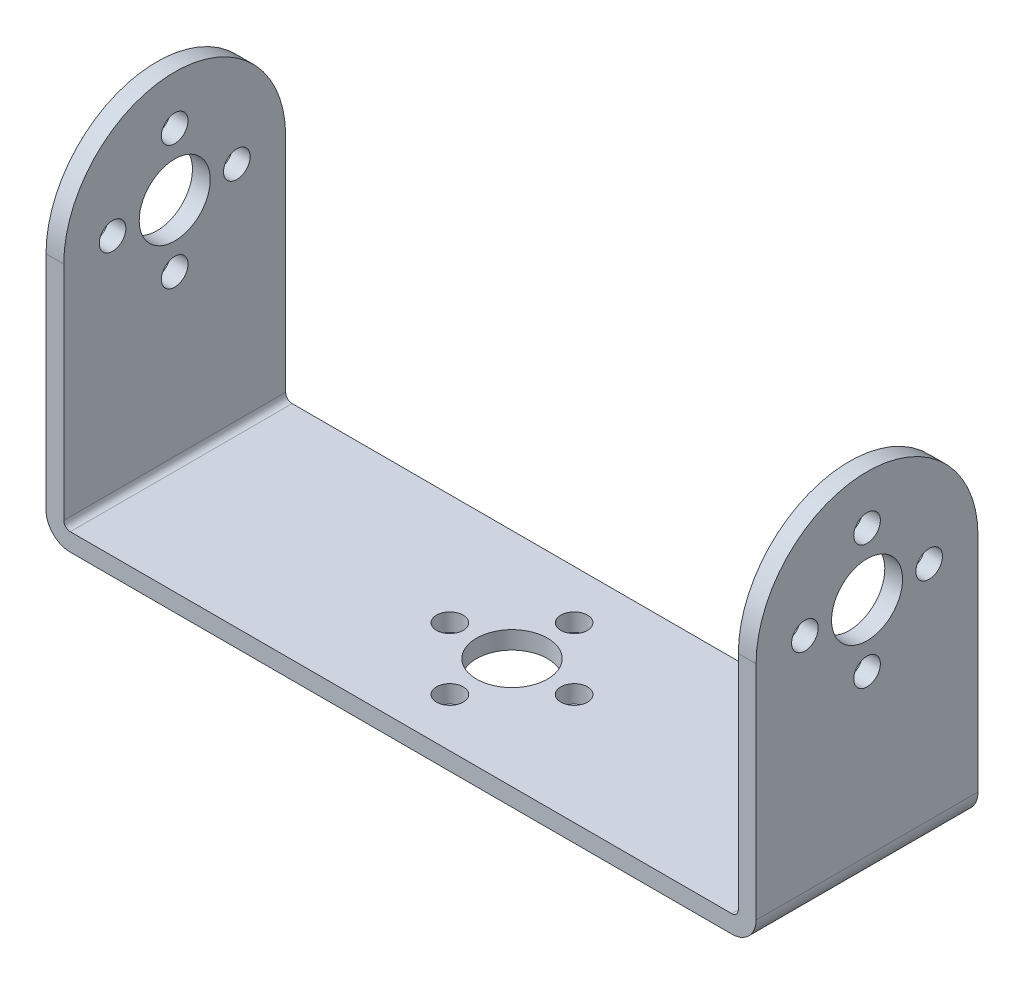
ISO-10303-21;
HEADER;
FILE_DESCRIPTION(('STEP AP214'),'2;1');
FILE_NAME('part.step','',(''),(''),'','','');
FILE_SCHEMA(('AUTOMOTIVE_DESIGN { 1 0 10303 214 1 1 1 1 }'));
ENDSEC;
DATA;
#1=APPLICATION_CONTEXT('core data for automotive mechanical design processes');
#2=APPLICATION_PROTOCOL_DEFINITION('international standard','automotive_design',2000,#1);
#3=PRODUCT_CONTEXT('',#1,'mechanical');
#4=PRODUCT('Part','Part','',(#3));
#5=PRODUCT_RELATED_PRODUCT_CATEGORY('part','',(#4));
#6=PRODUCT_DEFINITION_FORMATION('','',#4);
#7=PRODUCT_DEFINITION_CONTEXT('part definition',#1,'design');
#8=PRODUCT_DEFINITION('design','',#6,#7);
#9=PRODUCT_DEFINITION_SHAPE('','',#8);
#10=(LENGTH_UNIT() NAMED_UNIT(*) SI_UNIT(.MILLI.,.METRE.));
#11=(NAMED_UNIT(*) PLANE_ANGLE_UNIT() SI_UNIT($,.RADIAN.));
#12=(NAMED_UNIT(*) SI_UNIT($,.STERADIAN.) SOLID_ANGLE_UNIT());
#13=UNCERTAINTY_MEASURE_WITH_UNIT(LENGTH_MEASURE(1.E-05),#10,'distance_accuracy_value','');
#14=(GEOMETRIC_REPRESENTATION_CONTEXT(3) GLOBAL_UNCERTAINTY_ASSIGNED_CONTEXT((#13)) GLOBAL_UNIT_ASSIGNED_CONTEXT((#10,
#11,#12)) REPRESENTATION_CONTEXT('',''));
#15=CARTESIAN_POINT('',(0.,0.,0.));
#16=DIRECTION('',(0.,0.,1.));
#17=DIRECTION('',(1.,0.,0.));
#18=AXIS2_PLACEMENT_3D('',#15,#16,#17);
#19=CARTESIAN_POINT('',(64.6096345514955,-104.254644901112,29.6926910299003));
#20=DIRECTION('',(-1.,0.,0.));
#21=DIRECTION('',(0.,-1.,0.));
#22=AXIS2_PLACEMENT_3D('',#19,#20,#21);
#23=PLANE('',#22);
#24=CARTESIAN_POINT('',(64.609634551495,25.745355098888,29.6926910299003));
#25=DIRECTION('',(1.,0.,0.));
#26=DIRECTION('',(0.,-1.,0.));
#27=AXIS2_PLACEMENT_3D('',#24,#25,#26);
#28=CIRCLE('',#27,3.99999999999999);
#29=CARTESIAN_POINT('',(64.609634551495,21.745355098888,29.6926910299003));
#30=VERTEX_POINT('',#29);
#31=EDGE_CURVE('E258',#30,#30,#28,.F.);
#32=ORIENTED_EDGE('',*,*,#31,.F.);
#33=EDGE_LOOP('',(#32));
#34=FACE_BOUND('',#33,.T.);
#35=CARTESIAN_POINT('',(64.609634551495,25.745355098888,36.6926910299003));
#36=DIRECTION('',(1.,0.,0.));
#37=DIRECTION('',(0.,-1.,0.));
#38=AXIS2_PLACEMENT_3D('',#35,#36,#37);
#39=CIRCLE('',#38,1.49999999999999);
#40=CARTESIAN_POINT('',(64.609634551495,24.245355098888,36.6926910299003));
#41=VERTEX_POINT('',#40);
#42=EDGE_CURVE('E255',#41,#41,#39,.F.);
#43=ORIENTED_EDGE('',*,*,#42,.F.);
#44=EDGE_LOOP('',(#43));
#45=FACE_BOUND('',#44,.T.);
#46=CARTESIAN_POINT('',(64.609634551495,32.745355098888,29.6926910299003));
#47=DIRECTION('',(1.,0.,0.));
#48=DIRECTION('',(0.,-1.,0.));
#49=AXIS2_PLACEMENT_3D('',#46,#47,#48);
#50=CIRCLE('',#49,1.5);
#51=CARTESIAN_POINT('',(64.609634551495,31.245355098888,29.6926910299003));
#52=VERTEX_POINT('',#51);
#53=EDGE_CURVE('E252',#52,#52,#50,.F.);
#54=ORIENTED_EDGE('',*,*,#53,.F.);
#55=EDGE_LOOP('',(#54));
#56=FACE_BOUND('',#55,.T.);
#57=CARTESIAN_POINT('',(64.609634551495,25.745355098888,22.6926910299003));
#58=DIRECTION('',(1.,0.,0.));
#59=DIRECTION('',(0.,-1.,0.));
#60=AXIS2_PLACEMENT_3D('',#57,#58,#59);
#61=CIRCLE('',#60,1.5);
#62=CARTESIAN_POINT('',(64.609634551495,24.245355098888,22.6926910299003));
#63=VERTEX_POINT('',#62);
#64=EDGE_CURVE('E249',#63,#63,#61,.F.);
#65=ORIENTED_EDGE('',*,*,#64,.F.);
#66=EDGE_LOOP('',(#65));
#67=FACE_BOUND('',#66,.T.);
#68=CARTESIAN_POINT('',(64.609634551495,18.745355098888,29.6926910299003));
#69=DIRECTION('',(1.,0.,0.));
#70=DIRECTION('',(0.,-1.,0.));
#71=AXIS2_PLACEMENT_3D('',#68,#69,#70);
#72=CIRCLE('',#71,1.5);
#73=CARTESIAN_POINT('',(64.609634551495,17.245355098888,29.6926910299003));
#74=VERTEX_POINT('',#73);
#75=EDGE_CURVE('E246',#74,#74,#72,.F.);
#76=ORIENTED_EDGE('',*,*,#75,.F.);
#77=EDGE_LOOP('',(#76));
#78=FACE_BOUND('',#77,.T.);
#79=CARTESIAN_POINT('',(64.609634551495,25.745355098888,29.6926910299003));
#80=DIRECTION('',(1.,0.,0.));
#81=DIRECTION('',(0.,-1.,0.));
#82=AXIS2_PLACEMENT_3D('',#79,#80,#81);
#83=CIRCLE('',#82,12.5);
#84=CARTESIAN_POINT('',(64.6096345514951,25.745355098888,42.1926910299004));
#85=VERTEX_POINT('',#84);
#86=CARTESIAN_POINT('',(64.609634551495,25.745355098888,17.1926910299003));
#87=VERTEX_POINT('',#86);
#88=EDGE_CURVE('E242',#85,#87,#83,.F.);
#89=ORIENTED_EDGE('',*,*,#88,.T.);
#90=DIRECTION('',(0.,-1.,0.));
#91=VECTOR('',#90,1.);
#92=CARTESIAN_POINT('',(64.609634551495,-104.254644901112,17.1926910299003));
#93=LINE('',#92,#91);
#94=CARTESIAN_POINT('',(64.6096345514951,0.736600000000003,17.1926910299003));
#95=VERTEX_POINT('',#94);
#96=EDGE_CURVE('E428',#87,#95,#93,.T.);
#97=ORIENTED_EDGE('',*,*,#96,.T.);
#98=DIRECTION('',(0.,0.,-1.));
#99=VECTOR('',#98,1.);
#100=CARTESIAN_POINT('',(64.6096345514951,0.7366,54.9204760655417));
#101=LINE('',#100,#99);
#102=CARTESIAN_POINT('',(64.6096345514951,0.736599999999995,42.1926910299004));
#103=VERTEX_POINT('',#102);
#104=EDGE_CURVE('E425',#103,#95,#101,.T.);
#105=ORIENTED_EDGE('',*,*,#104,.F.);
#106=DIRECTION('',(0.,1.,0.));
#107=VECTOR('',#106,1.);
#108=CARTESIAN_POINT('',(64.6096345514951,-104.254644901112,42.1926910299004));
#109=LINE('',#108,#107);
#110=EDGE_CURVE('E245',#103,#85,#109,.T.);
#111=ORIENTED_EDGE('',*,*,#110,.T.);
#112=EDGE_LOOP('',(#89,#97,#105,#111));
#113=FACE_BOUND('',#112,.T.);
#114=ADVANCED_FACE('F36',(#34,#45,#56,#67,#78,#113),#23,.T.);
#115=CARTESIAN_POINT('',(-11.3903654485048,25.745355098888,29.6926910299003));
#116=DIRECTION('',(1.,0.,0.));
#117=DIRECTION('',(0.,1.,0.));
#118=AXIS2_PLACEMENT_3D('',#115,#116,#117);
#119=PLANE('',#118);
#120=DIRECTION('',(0.,1.,0.));
#121=VECTOR('',#120,1.);
#122=CARTESIAN_POINT('',(-11.3903654485048,25.745355098888,42.1926910299004));
#123=LINE('',#122,#121);
#124=CARTESIAN_POINT('',(-11.3903654485048,25.745355098888,42.1926910299004));
#125=VERTEX_POINT('',#124);
#126=CARTESIAN_POINT('',(-11.3903654485049,0.736600000000006,42.1926910299004));
#127=VERTEX_POINT('',#126);
#128=EDGE_CURVE('E143',#125,#127,#123,.F.);
#129=ORIENTED_EDGE('',*,*,#128,.T.);
#130=DIRECTION('',(0.,0.,1.));
#131=VECTOR('',#130,1.);
#132=CARTESIAN_POINT('',(-11.3903654485049,0.7366,4.46490599425907));
#133=LINE('',#132,#131);
#134=CARTESIAN_POINT('',(-11.3903654485049,0.736600000000002,17.1926910299003));
#135=VERTEX_POINT('',#134);
#136=EDGE_CURVE('E241',#135,#127,#133,.T.);
#137=ORIENTED_EDGE('',*,*,#136,.F.);
#138=DIRECTION('',(0.,-1.,0.));
#139=VECTOR('',#138,1.);
#140=CARTESIAN_POINT('',(-11.3903654485049,25.745355098888,17.1926910299003));
#141=LINE('',#140,#139);
#142=CARTESIAN_POINT('',(-11.3903654485049,25.745355098888,17.1926910299003));
#143=VERTEX_POINT('',#142);
#144=EDGE_CURVE('E144',#135,#143,#141,.F.);
#145=ORIENTED_EDGE('',*,*,#144,.T.);
#146=CARTESIAN_POINT('',(-11.3903654485048,25.745355098888,29.6926910299003));
#147=DIRECTION('',(-1.,0.,0.));
#148=DIRECTION('',(0.,1.,0.));
#149=AXIS2_PLACEMENT_3D('',#146,#147,#148);
#150=CIRCLE('',#149,12.5);
#151=EDGE_CURVE('E39',#143,#125,#150,.F.);
#152=ORIENTED_EDGE('',*,*,#151,.T.);
#153=EDGE_LOOP('',(#129,#137,#145,#152));
#154=FACE_BOUND('',#153,.T.);
#155=CARTESIAN_POINT('',(-11.3903654485048,25.745355098888,29.6926910299003));
#156=DIRECTION('',(-1.,0.,0.));
#157=DIRECTION('',(0.,1.,0.));
#158=AXIS2_PLACEMENT_3D('',#155,#156,#157);
#159=CIRCLE('',#158,3.99999999999999);
#160=CARTESIAN_POINT('',(-11.3903654485048,29.745355098888,29.6926910299003));
#161=VERTEX_POINT('',#160);
#162=EDGE_CURVE('E261',#161,#161,#159,.F.);
#163=ORIENTED_EDGE('',*,*,#162,.F.);
#164=EDGE_LOOP('',(#163));
#165=FACE_BOUND('',#164,.T.);
#166=CARTESIAN_POINT('',(-11.3903654485048,25.745355098888,36.6926910299003));
#167=DIRECTION('',(-1.,0.,0.));
#168=DIRECTION('',(0.,1.,0.));
#169=AXIS2_PLACEMENT_3D('',#166,#167,#168);
#170=CIRCLE('',#169,1.50000000000003);
#171=CARTESIAN_POINT('',(-11.3903654485048,27.245355098888,36.6926910299003));
#172=VERTEX_POINT('',#171);
#173=EDGE_CURVE('E264',#172,#172,#170,.F.);
#174=ORIENTED_EDGE('',*,*,#173,.F.);
#175=EDGE_LOOP('',(#174));
#176=FACE_BOUND('',#175,.T.);
#177=CARTESIAN_POINT('',(-11.3903654485048,32.745355098888,29.6926910299003));
#178=DIRECTION('',(-1.,0.,0.));
#179=DIRECTION('',(0.,1.,0.));
#180=AXIS2_PLACEMENT_3D('',#177,#178,#179);
#181=CIRCLE('',#180,1.50000000000003);
#182=CARTESIAN_POINT('',(-11.3903654485048,34.245355098888,29.6926910299003));
#183=VERTEX_POINT('',#182);
#184=EDGE_CURVE('E267',#183,#183,#181,.F.);
#185=ORIENTED_EDGE('',*,*,#184,.F.);
#186=EDGE_LOOP('',(#185));
#187=FACE_BOUND('',#186,.T.);
#188=CARTESIAN_POINT('',(-11.3903654485048,25.745355098888,22.6926910299003));
#189=DIRECTION('',(-1.,0.,0.));
#190=DIRECTION('',(0.,1.,0.));
#191=AXIS2_PLACEMENT_3D('',#188,#189,#190);
#192=CIRCLE('',#191,1.50000000000003);
#193=CARTESIAN_POINT('',(-11.3903654485048,27.245355098888,22.6926910299003));
#194=VERTEX_POINT('',#193);
#195=EDGE_CURVE('E270',#194,#194,#192,.F.);
#196=ORIENTED_EDGE('',*,*,#195,.F.);
#197=EDGE_LOOP('',(#196));
#198=FACE_BOUND('',#197,.T.);
#199=CARTESIAN_POINT('',(-11.3903654485048,18.745355098888,29.6926910299003));
#200=DIRECTION('',(-1.,0.,0.));
#201=DIRECTION('',(0.,1.,0.));
#202=AXIS2_PLACEMENT_3D('',#199,#200,#201);
#203=CIRCLE('',#202,1.50000000000003);
#204=CARTESIAN_POINT('',(-11.3903654485048,20.245355098888,29.6926910299003));
#205=VERTEX_POINT('',#204);
#206=EDGE_CURVE('E136',#205,#205,#203,.F.);
#207=ORIENTED_EDGE('',*,*,#206,.F.);
#208=EDGE_LOOP('',(#207));
#209=FACE_BOUND('',#208,.T.);
#210=ADVANCED_FACE('F140',(#154,#165,#176,#187,#198,#209),#119,.T.);
#211=CARTESIAN_POINT('',(-13.3903654485048,25.745355098888,29.6926910299003));
#212=DIRECTION('',(1.,0.,0.));
#213=DIRECTION('',(0.,1.,0.));
#214=AXIS2_PLACEMENT_3D('',#211,#212,#213);
#215=CYLINDRICAL_SURFACE('',#214,12.5);
#216=CARTESIAN_POINT('',(-13.3903654485048,25.745355098888,29.6926910299003));
#217=DIRECTION('',(-1.,0.,0.));
#218=DIRECTION('',(0.,1.,0.));
#219=AXIS2_PLACEMENT_3D('',#216,#217,#218);
#220=CIRCLE('',#219,12.5);
#221=CARTESIAN_POINT('',(-13.3903654485048,25.745355098888,42.1926910299004));
#222=VERTEX_POINT('',#221);
#223=CARTESIAN_POINT('',(-13.3903654485048,25.745355098888,17.1926910299003));
#224=VERTEX_POINT('',#223);
#225=EDGE_CURVE('E132',#222,#224,#220,.T.);
#226=ORIENTED_EDGE('',*,*,#225,.F.);
#227=DIRECTION('',(1.,0.,0.));
#228=VECTOR('',#227,1.);
#229=CARTESIAN_POINT('',(-13.3903654485048,25.745355098888,42.1926910299003));
#230=LINE('',#229,#228);
#231=EDGE_CURVE('E127',#125,#222,#230,.F.);
#232=ORIENTED_EDGE('',*,*,#231,.F.);
#233=ORIENTED_EDGE('',*,*,#151,.F.);
#234=DIRECTION('',(1.,0.,0.));
#235=VECTOR('',#234,1.);
#236=CARTESIAN_POINT('',(-13.3903654485048,25.745355098888,17.1926910299003));
#237=LINE('',#236,#235);
#238=EDGE_CURVE('E121',#143,#224,#237,.F.);
#239=ORIENTED_EDGE('',*,*,#238,.T.);
#240=EDGE_LOOP('',(#226,#232,#233,#239));
#241=FACE_BOUND('',#240,.T.);
#242=ADVANCED_FACE('F129',(#241),#215,.T.);
#243=CARTESIAN_POINT('',(-21.3903654485048,18.745355098888,29.6926910299003));
#244=DIRECTION('',(1.,0.,0.));
#245=DIRECTION('',(0.,1.,0.));
#246=AXIS2_PLACEMENT_3D('',#243,#244,#245);
#247=CYLINDRICAL_SURFACE('',#246,1.50000000000003);
#248=CARTESIAN_POINT('',(-13.3903654485048,18.745355098888,29.6926910299003));
#249=DIRECTION('',(-1.,0.,0.));
#250=DIRECTION('',(0.,1.,0.));
#251=AXIS2_PLACEMENT_3D('',#248,#249,#250);
#252=CIRCLE('',#251,1.50000000000003);
#253=CARTESIAN_POINT('',(-13.3903654485048,20.245355098888,29.6926910299003));
#254=VERTEX_POINT('',#253);
#255=EDGE_CURVE('E234',#254,#254,#252,.F.);
#256=ORIENTED_EDGE('',*,*,#255,.F.);
#257=EDGE_LOOP('',(#256));
#258=FACE_BOUND('',#257,.T.);
#259=ORIENTED_EDGE('',*,*,#206,.T.);
#260=EDGE_LOOP('',(#259));
#261=FACE_BOUND('',#260,.T.);
#262=ADVANCED_FACE('F275',(#258,#261),#247,.F.);
#263=CARTESIAN_POINT('',(-21.3903654485048,25.745355098888,22.6926910299003));
#264=DIRECTION('',(1.,0.,0.));
#265=DIRECTION('',(0.,1.,0.));
#266=AXIS2_PLACEMENT_3D('',#263,#264,#265);
#267=CYLINDRICAL_SURFACE('',#266,1.50000000000003);
#268=CARTESIAN_POINT('',(-13.3903654485048,25.745355098888,22.6926910299003));
#269=DIRECTION('',(-1.,0.,0.));
#270=DIRECTION('',(0.,1.,0.));
#271=AXIS2_PLACEMENT_3D('',#268,#269,#270);
#272=CIRCLE('',#271,1.50000000000003);
#273=CARTESIAN_POINT('',(-13.3903654485048,27.245355098888,22.6926910299003));
#274=VERTEX_POINT('',#273);
#275=EDGE_CURVE('E231',#274,#274,#272,.F.);
#276=ORIENTED_EDGE('',*,*,#275,.F.);
#277=EDGE_LOOP('',(#276));
#278=FACE_BOUND('',#277,.T.);
#279=ORIENTED_EDGE('',*,*,#195,.T.);
#280=EDGE_LOOP('',(#279));
#281=FACE_BOUND('',#280,.T.);
#282=ADVANCED_FACE('F287',(#278,#281),#267,.F.);
#283=CARTESIAN_POINT('',(-21.3903654485048,32.745355098888,29.6926910299003));
#284=DIRECTION('',(1.,0.,0.));
#285=DIRECTION('',(0.,1.,0.));
#286=AXIS2_PLACEMENT_3D('',#283,#284,#285);
#287=CYLINDRICAL_SURFACE('',#286,1.50000000000003);
#288=CARTESIAN_POINT('',(-13.3903654485048,32.745355098888,29.6926910299003));
#289=DIRECTION('',(-1.,0.,0.));
#290=DIRECTION('',(0.,1.,0.));
#291=AXIS2_PLACEMENT_3D('',#288,#289,#290);
#292=CIRCLE('',#291,1.50000000000003);
#293=CARTESIAN_POINT('',(-13.3903654485048,34.245355098888,29.6926910299003));
#294=VERTEX_POINT('',#293);
#295=EDGE_CURVE('E228',#294,#294,#292,.F.);
#296=ORIENTED_EDGE('',*,*,#295,.F.);
#297=EDGE_LOOP('',(#296));
#298=FACE_BOUND('',#297,.T.);
#299=ORIENTED_EDGE('',*,*,#184,.T.);
#300=EDGE_LOOP('',(#299));
#301=FACE_BOUND('',#300,.T.);
#302=ADVANCED_FACE('F291',(#298,#301),#287,.F.);
#303=CARTESIAN_POINT('',(-21.3903654485048,25.745355098888,36.6926910299003));
#304=DIRECTION('',(1.,0.,0.));
#305=DIRECTION('',(0.,1.,0.));
#306=AXIS2_PLACEMENT_3D('',#303,#304,#305);
#307=CYLINDRICAL_SURFACE('',#306,1.50000000000003);
#308=CARTESIAN_POINT('',(-13.3903654485048,25.745355098888,36.6926910299003));
#309=DIRECTION('',(-1.,0.,0.));
#310=DIRECTION('',(0.,1.,0.));
#311=AXIS2_PLACEMENT_3D('',#308,#309,#310);
#312=CIRCLE('',#311,1.50000000000003);
#313=CARTESIAN_POINT('',(-13.3903654485048,27.245355098888,36.6926910299003));
#314=VERTEX_POINT('',#313);
#315=EDGE_CURVE('E225',#314,#314,#312,.F.);
#316=ORIENTED_EDGE('',*,*,#315,.F.);
#317=EDGE_LOOP('',(#316));
#318=FACE_BOUND('',#317,.T.);
#319=ORIENTED_EDGE('',*,*,#173,.T.);
#320=EDGE_LOOP('',(#319));
#321=FACE_BOUND('',#320,.T.);
#322=ADVANCED_FACE('F295',(#318,#321),#307,.F.);
#323=CARTESIAN_POINT('',(-21.3903654485048,25.745355098888,29.6926910299003));
#324=DIRECTION('',(1.,0.,0.));
#325=DIRECTION('',(0.,1.,0.));
#326=AXIS2_PLACEMENT_3D('',#323,#324,#325);
#327=CYLINDRICAL_SURFACE('',#326,3.99999999999999);
#328=CARTESIAN_POINT('',(-13.3903654485048,25.745355098888,29.6926910299003));
#329=DIRECTION('',(-1.,0.,0.));
#330=DIRECTION('',(0.,1.,0.));
#331=AXIS2_PLACEMENT_3D('',#328,#329,#330);
#332=CIRCLE('',#331,3.99999999999999);
#333=CARTESIAN_POINT('',(-13.3903654485048,29.745355098888,29.6926910299003));
#334=VERTEX_POINT('',#333);
#335=EDGE_CURVE('E222',#334,#334,#332,.F.);
#336=ORIENTED_EDGE('',*,*,#335,.F.);
#337=EDGE_LOOP('',(#336));
#338=FACE_BOUND('',#337,.T.);
#339=ORIENTED_EDGE('',*,*,#162,.T.);
#340=EDGE_LOOP('',(#339));
#341=FACE_BOUND('',#340,.T.);
#342=ADVANCED_FACE('F299',(#338,#341),#327,.F.);
#343=CARTESIAN_POINT('',(74.609634551495,25.745355098888,29.6926910299003));
#344=DIRECTION('',(-1.,0.,0.));
#345=DIRECTION('',(0.,-1.,0.));
#346=AXIS2_PLACEMENT_3D('',#343,#344,#345);
#347=CYLINDRICAL_SURFACE('',#346,3.99999999999999);
#348=CARTESIAN_POINT('',(66.609634551495,25.745355098888,29.6926910299003));
#349=DIRECTION('',(1.,0.,0.));
#350=DIRECTION('',(0.,-1.,0.));
#351=AXIS2_PLACEMENT_3D('',#348,#349,#350);
#352=CIRCLE('',#351,3.99999999999999);
#353=CARTESIAN_POINT('',(66.609634551495,21.745355098888,29.6926910299003));
#354=VERTEX_POINT('',#353);
#355=EDGE_CURVE('E215',#354,#354,#352,.F.);
#356=ORIENTED_EDGE('',*,*,#355,.F.);
#357=EDGE_LOOP('',(#356));
#358=FACE_BOUND('',#357,.T.);
#359=ORIENTED_EDGE('',*,*,#31,.T.);
#360=EDGE_LOOP('',(#359));
#361=FACE_BOUND('',#360,.T.);
#362=ADVANCED_FACE('F303',(#358,#361),#347,.F.);
#363=CARTESIAN_POINT('',(74.609634551495,25.745355098888,36.6926910299003));
#364=DIRECTION('',(-1.,0.,0.));
#365=DIRECTION('',(0.,-1.,0.));
#366=AXIS2_PLACEMENT_3D('',#363,#364,#365);
#367=CYLINDRICAL_SURFACE('',#366,1.49999999999999);
#368=CARTESIAN_POINT('',(66.609634551495,25.745355098888,36.6926910299003));
#369=DIRECTION('',(1.,0.,0.));
#370=DIRECTION('',(0.,-1.,0.));
#371=AXIS2_PLACEMENT_3D('',#368,#369,#370);
#372=CIRCLE('',#371,1.49999999999999);
#373=CARTESIAN_POINT('',(66.609634551495,24.245355098888,36.6926910299003));
#374=VERTEX_POINT('',#373);
#375=EDGE_CURVE('E212',#374,#374,#372,.F.);
#376=ORIENTED_EDGE('',*,*,#375,.F.);
#377=EDGE_LOOP('',(#376));
#378=FACE_BOUND('',#377,.T.);
#379=ORIENTED_EDGE('',*,*,#42,.T.);
#380=EDGE_LOOP('',(#379));
#381=FACE_BOUND('',#380,.T.);
#382=ADVANCED_FACE('F307',(#378,#381),#367,.F.);
#383=CARTESIAN_POINT('',(74.609634551495,32.745355098888,29.6926910299003));
#384=DIRECTION('',(-1.,0.,0.));
#385=DIRECTION('',(0.,-1.,0.));
#386=AXIS2_PLACEMENT_3D('',#383,#384,#385);
#387=CYLINDRICAL_SURFACE('',#386,1.5);
#388=CARTESIAN_POINT('',(66.609634551495,32.745355098888,29.6926910299003));
#389=DIRECTION('',(1.,0.,0.));
#390=DIRECTION('',(0.,-1.,0.));
#391=AXIS2_PLACEMENT_3D('',#388,#389,#390);
#392=CIRCLE('',#391,1.5);
#393=CARTESIAN_POINT('',(66.609634551495,31.245355098888,29.6926910299003));
#394=VERTEX_POINT('',#393);
#395=EDGE_CURVE('E209',#394,#394,#392,.F.);
#396=ORIENTED_EDGE('',*,*,#395,.F.);
#397=EDGE_LOOP('',(#396));
#398=FACE_BOUND('',#397,.T.);
#399=ORIENTED_EDGE('',*,*,#53,.T.);
#400=EDGE_LOOP('',(#399));
#401=FACE_BOUND('',#400,.T.);
#402=ADVANCED_FACE('F311',(#398,#401),#387,.F.);
#403=CARTESIAN_POINT('',(74.609634551495,25.745355098888,22.6926910299003));
#404=DIRECTION('',(-1.,0.,0.));
#405=DIRECTION('',(0.,-1.,0.));
#406=AXIS2_PLACEMENT_3D('',#403,#404,#405);
#407=CYLINDRICAL_SURFACE('',#406,1.5);
#408=CARTESIAN_POINT('',(66.609634551495,25.745355098888,22.6926910299003));
#409=DIRECTION('',(1.,0.,0.));
#410=DIRECTION('',(0.,-1.,0.));
#411=AXIS2_PLACEMENT_3D('',#408,#409,#410);
#412=CIRCLE('',#411,1.5);
#413=CARTESIAN_POINT('',(66.609634551495,24.245355098888,22.6926910299003));
#414=VERTEX_POINT('',#413);
#415=EDGE_CURVE('E206',#414,#414,#412,.F.);
#416=ORIENTED_EDGE('',*,*,#415,.F.);
#417=EDGE_LOOP('',(#416));
#418=FACE_BOUND('',#417,.T.);
#419=ORIENTED_EDGE('',*,*,#64,.T.);
#420=EDGE_LOOP('',(#419));
#421=FACE_BOUND('',#420,.T.);
#422=ADVANCED_FACE('F315',(#418,#421),#407,.F.);
#423=CARTESIAN_POINT('',(74.609634551495,18.745355098888,29.6926910299003));
#424=DIRECTION('',(-1.,0.,0.));
#425=DIRECTION('',(0.,-1.,0.));
#426=AXIS2_PLACEMENT_3D('',#423,#424,#425);
#427=CYLINDRICAL_SURFACE('',#426,1.5);
#428=CARTESIAN_POINT('',(66.609634551495,18.745355098888,29.6926910299003));
#429=DIRECTION('',(1.,0.,0.));
#430=DIRECTION('',(0.,-1.,0.));
#431=AXIS2_PLACEMENT_3D('',#428,#429,#430);
#432=CIRCLE('',#431,1.5);
#433=CARTESIAN_POINT('',(66.609634551495,17.245355098888,29.6926910299003));
#434=VERTEX_POINT('',#433);
#435=EDGE_CURVE('E203',#434,#434,#432,.F.);
#436=ORIENTED_EDGE('',*,*,#435,.F.);
#437=EDGE_LOOP('',(#436));
#438=FACE_BOUND('',#437,.T.);
#439=ORIENTED_EDGE('',*,*,#75,.T.);
#440=EDGE_LOOP('',(#439));
#441=FACE_BOUND('',#440,.T.);
#442=ADVANCED_FACE('F319',(#438,#441),#427,.F.);
#443=CARTESIAN_POINT('',(66.609634551495,25.745355098888,29.6926910299003));
#444=DIRECTION('',(-1.,0.,0.));
#445=DIRECTION('',(0.,-1.,0.));
#446=AXIS2_PLACEMENT_3D('',#443,#444,#445);
#447=CYLINDRICAL_SURFACE('',#446,12.5);
#448=CARTESIAN_POINT('',(66.609634551495,25.745355098888,29.6926910299003));
#449=DIRECTION('',(1.,0.,0.));
#450=DIRECTION('',(0.,-1.,0.));
#451=AXIS2_PLACEMENT_3D('',#448,#449,#450);
#452=CIRCLE('',#451,12.5);
#453=CARTESIAN_POINT('',(66.609634551495,25.745355098888,17.1926910299003));
#454=VERTEX_POINT('',#453);
#455=CARTESIAN_POINT('',(66.609634551495,25.745355098888,42.1926910299004));
#456=VERTEX_POINT('',#455);
#457=EDGE_CURVE('E199',#454,#456,#452,.T.);
#458=ORIENTED_EDGE('',*,*,#457,.F.);
#459=DIRECTION('',(1.,0.,0.));
#460=VECTOR('',#459,1.);
#461=CARTESIAN_POINT('',(66.6096345514955,25.745355098888,17.1926910299003));
#462=LINE('',#461,#460);
#463=EDGE_CURVE('E431',#454,#87,#462,.F.);
#464=ORIENTED_EDGE('',*,*,#463,.T.);
#465=ORIENTED_EDGE('',*,*,#88,.F.);
#466=DIRECTION('',(1.,0.,0.));
#467=VECTOR('',#466,1.);
#468=CARTESIAN_POINT('',(66.6096345514955,25.745355098888,42.1926910299004));
#469=LINE('',#468,#467);
#470=EDGE_CURVE('E433',#85,#456,#469,.T.);
#471=ORIENTED_EDGE('',*,*,#470,.T.);
#472=EDGE_LOOP('',(#458,#464,#465,#471));
#473=FACE_BOUND('',#472,.T.);
#474=ADVANCED_FACE('F323',(#473),#447,.T.);
#475=CARTESIAN_POINT('',(63.8730345514951,0.7366,54.9204760655417));
#476=DIRECTION('',(0.,0.,-1.));
#477=DIRECTION('',(1.,0.,0.));
#478=AXIS2_PLACEMENT_3D('',#475,#476,#477);
#479=CYLINDRICAL_SURFACE('',#478,0.736600000000004);
#480=CARTESIAN_POINT('',(63.8730345514951,0.7366,17.1926910299003));
#481=DIRECTION('',(0.,0.,1.));
#482=DIRECTION('',(1.,0.,0.));
#483=AXIS2_PLACEMENT_3D('',#480,#481,#482);
#484=CIRCLE('',#483,0.736600000000004);
#485=CARTESIAN_POINT('',(63.8730345514951,0.,17.1926910299003));
#486=VERTEX_POINT('',#485);
#487=EDGE_CURVE('E194',#95,#486,#484,.F.);
#488=ORIENTED_EDGE('',*,*,#487,.T.);
#489=DIRECTION('',(0.,0.,-1.));
#490=VECTOR('',#489,1.);
#491=CARTESIAN_POINT('',(63.8730345514951,0.,29.6926910299003));
#492=LINE('',#491,#490);
#493=CARTESIAN_POINT('',(63.8730345514951,0.,42.1926910299004));
#494=VERTEX_POINT('',#493);
#495=EDGE_CURVE('E197',#486,#494,#492,.F.);
#496=ORIENTED_EDGE('',*,*,#495,.T.);
#497=CARTESIAN_POINT('',(63.8730345514951,0.7366,42.1926910299004));
#498=DIRECTION('',(0.,0.,1.));
#499=DIRECTION('',(1.,0.,0.));
#500=AXIS2_PLACEMENT_3D('',#497,#498,#499);
#501=CIRCLE('',#500,0.736600000000004);
#502=EDGE_CURVE('E218',#494,#103,#501,.T.);
#503=ORIENTED_EDGE('',*,*,#502,.T.);
#504=ORIENTED_EDGE('',*,*,#104,.T.);
#505=EDGE_LOOP('',(#488,#496,#503,#504));
#506=FACE_BOUND('',#505,.T.);
#507=ADVANCED_FACE('F327',(#506),#479,.F.);
#508=CARTESIAN_POINT('',(-10.6537654485049,0.7366,4.46490599425907));
#509=DIRECTION('',(0.,0.,1.));
#510=DIRECTION('',(-1.,0.,0.));
#511=AXIS2_PLACEMENT_3D('',#508,#509,#510);
#512=CYLINDRICAL_SURFACE('',#511,0.7366);
#513=ORIENTED_EDGE('',*,*,#136,.T.);
#514=CARTESIAN_POINT('',(-10.6537654485049,0.7366,42.1926910299004));
#515=DIRECTION('',(0.,0.,-1.));
#516=DIRECTION('',(-1.,0.,0.));
#517=AXIS2_PLACEMENT_3D('',#514,#515,#516);
#518=CIRCLE('',#517,0.7366);
#519=CARTESIAN_POINT('',(-10.6537654485049,0.,42.1926910299004));
#520=VERTEX_POINT('',#519);
#521=EDGE_CURVE('E148',#127,#520,#518,.F.);
#522=ORIENTED_EDGE('',*,*,#521,.T.);
#523=DIRECTION('',(0.,0.,-1.));
#524=VECTOR('',#523,1.);
#525=CARTESIAN_POINT('',(-10.6537654485049,0.,29.6926910299003));
#526=LINE('',#525,#524);
#527=CARTESIAN_POINT('',(-10.6537654485049,0.,17.1926910299003));
#528=VERTEX_POINT('',#527);
#529=EDGE_CURVE('E414',#520,#528,#526,.T.);
#530=ORIENTED_EDGE('',*,*,#529,.T.);
#531=CARTESIAN_POINT('',(-10.6537654485049,0.7366,17.1926910299003));
#532=DIRECTION('',(0.,0.,-1.));
#533=DIRECTION('',(-1.,0.,0.));
#534=AXIS2_PLACEMENT_3D('',#531,#532,#533);
#535=CIRCLE('',#534,0.7366);
#536=EDGE_CURVE('E220',#528,#135,#535,.T.);
#537=ORIENTED_EDGE('',*,*,#536,.T.);
#538=EDGE_LOOP('',(#513,#522,#530,#537));
#539=FACE_BOUND('',#538,.T.);
#540=ADVANCED_FACE('F331',(#539),#512,.F.);
#541=CARTESIAN_POINT('',(-13.3903654485048,25.745355098888,29.6926910299003));
#542=DIRECTION('',(1.,0.,0.));
#543=DIRECTION('',(0.,1.,0.));
#544=AXIS2_PLACEMENT_3D('',#541,#542,#543);
#545=PLANE('',#544);
#546=ORIENTED_EDGE('',*,*,#335,.T.);
#547=EDGE_LOOP('',(#546));
#548=FACE_BOUND('',#547,.T.);
#549=ORIENTED_EDGE('',*,*,#315,.T.);
#550=EDGE_LOOP('',(#549));
#551=FACE_BOUND('',#550,.T.);
#552=ORIENTED_EDGE('',*,*,#295,.T.);
#553=EDGE_LOOP('',(#552));
#554=FACE_BOUND('',#553,.T.);
#555=ORIENTED_EDGE('',*,*,#275,.T.);
#556=EDGE_LOOP('',(#555));
#557=FACE_BOUND('',#556,.T.);
#558=ORIENTED_EDGE('',*,*,#255,.T.);
#559=EDGE_LOOP('',(#558));
#560=FACE_BOUND('',#559,.T.);
#561=DIRECTION('',(0.,1.,0.));
#562=VECTOR('',#561,1.);
#563=CARTESIAN_POINT('',(-13.3903654485048,25.745355098888,17.1926910299003));
#564=LINE('',#563,#562);
#565=CARTESIAN_POINT('',(-13.3903654485049,0.736600000000005,17.1926910299003));
#566=VERTEX_POINT('',#565);
#567=EDGE_CURVE('E237',#224,#566,#564,.F.);
#568=ORIENTED_EDGE('',*,*,#567,.T.);
#569=DIRECTION('',(0.,0.,1.));
#570=VECTOR('',#569,1.);
#571=CARTESIAN_POINT('',(-13.3903654485049,0.7366,4.46490599425907));
#572=LINE('',#571,#570);
#573=CARTESIAN_POINT('',(-13.3903654485049,0.736600000000006,42.1926910299004));
#574=VERTEX_POINT('',#573);
#575=EDGE_CURVE('E189',#566,#574,#572,.T.);
#576=ORIENTED_EDGE('',*,*,#575,.T.);
#577=DIRECTION('',(0.,1.,0.));
#578=VECTOR('',#577,1.);
#579=CARTESIAN_POINT('',(-13.3903654485048,25.745355098888,42.1926910299004));
#580=LINE('',#579,#578);
#581=EDGE_CURVE('E239',#574,#222,#580,.T.);
#582=ORIENTED_EDGE('',*,*,#581,.T.);
#583=ORIENTED_EDGE('',*,*,#225,.T.);
#584=EDGE_LOOP('',(#568,#576,#582,#583));
#585=FACE_BOUND('',#584,.T.);
#586=ADVANCED_FACE('F335',(#548,#551,#554,#557,#560,#585),#545,.F.);
#587=CARTESIAN_POINT('',(66.6096345514955,-104.254644901112,29.6926910299003));
#588=DIRECTION('',(-1.,0.,0.));
#589=DIRECTION('',(0.,-1.,0.));
#590=AXIS2_PLACEMENT_3D('',#587,#588,#589);
#591=PLANE('',#590);
#592=DIRECTION('',(0.,0.,-1.));
#593=VECTOR('',#592,1.);
#594=CARTESIAN_POINT('',(66.6096345514951,0.7366,54.9204760655417));
#595=LINE('',#594,#593);
#596=CARTESIAN_POINT('',(66.6096345514951,0.736600000000006,42.1926910299004));
#597=VERTEX_POINT('',#596);
#598=CARTESIAN_POINT('',(66.6096345514951,0.736600000000008,17.1926910299003));
#599=VERTEX_POINT('',#598);
#600=EDGE_CURVE('E183',#597,#599,#595,.T.);
#601=ORIENTED_EDGE('',*,*,#600,.T.);
#602=DIRECTION('',(0.,-1.,0.));
#603=VECTOR('',#602,1.);
#604=CARTESIAN_POINT('',(66.6096345514955,-104.254644901112,17.1926910299003));
#605=LINE('',#604,#603);
#606=EDGE_CURVE('E198',#599,#454,#605,.F.);
#607=ORIENTED_EDGE('',*,*,#606,.T.);
#608=ORIENTED_EDGE('',*,*,#457,.T.);
#609=DIRECTION('',(0.,-1.,0.));
#610=VECTOR('',#609,1.);
#611=CARTESIAN_POINT('',(66.6096345514955,-104.254644901112,42.1926910299004));
#612=LINE('',#611,#610);
#613=EDGE_CURVE('E202',#456,#597,#612,.T.);
#614=ORIENTED_EDGE('',*,*,#613,.T.);
#615=EDGE_LOOP('',(#601,#607,#608,#614));
#616=FACE_BOUND('',#615,.T.);
#617=ORIENTED_EDGE('',*,*,#435,.T.);
#618=EDGE_LOOP('',(#617));
#619=FACE_BOUND('',#618,.T.);
#620=ORIENTED_EDGE('',*,*,#415,.T.);
#621=EDGE_LOOP('',(#620));
#622=FACE_BOUND('',#621,.T.);
#623=ORIENTED_EDGE('',*,*,#395,.T.);
#624=EDGE_LOOP('',(#623));
#625=FACE_BOUND('',#624,.T.);
#626=ORIENTED_EDGE('',*,*,#375,.T.);
#627=EDGE_LOOP('',(#626));
#628=FACE_BOUND('',#627,.T.);
#629=ORIENTED_EDGE('',*,*,#355,.T.);
#630=EDGE_LOOP('',(#629));
#631=FACE_BOUND('',#630,.T.);
#632=ADVANCED_FACE('F339',(#616,#619,#622,#625,#628,#631),#591,.F.);
#633=CARTESIAN_POINT('',(-38.3903654485049,0.,29.6926910299003));
#634=DIRECTION('',(0.,1.,0.));
#635=DIRECTION('',(0.,0.,-1.));
#636=AXIS2_PLACEMENT_3D('',#633,#634,#635);
#637=PLANE('',#636);
#638=DIRECTION('',(-1.,0.,0.));
#639=VECTOR('',#638,1.);
#640=CARTESIAN_POINT('',(-38.3903654485049,0.,42.1926910299004));
#641=LINE('',#640,#639);
#642=EDGE_CURVE('E193',#520,#494,#641,.F.);
#643=ORIENTED_EDGE('',*,*,#642,.T.);
#644=ORIENTED_EDGE('',*,*,#495,.F.);
#645=DIRECTION('',(1.,0.,0.));
#646=VECTOR('',#645,1.);
#647=CARTESIAN_POINT('',(-38.3903654485049,0.,17.1926910299003));
#648=LINE('',#647,#646);
#649=EDGE_CURVE('E186',#486,#528,#648,.F.);
#650=ORIENTED_EDGE('',*,*,#649,.T.);
#651=ORIENTED_EDGE('',*,*,#529,.F.);
#652=EDGE_LOOP('',(#643,#644,#650,#651));
#653=FACE_BOUND('',#652,.T.);
#654=CARTESIAN_POINT('',(26.6096345514951,0.,22.6926910299003));
#655=DIRECTION('',(0.,-1.,0.));
#656=DIRECTION('',(0.,0.,-1.));
#657=AXIS2_PLACEMENT_3D('',#654,#655,#656);
#658=CIRCLE('',#657,1.5);
#659=CARTESIAN_POINT('',(26.6096345514951,0.,21.1926910299003));
#660=VERTEX_POINT('',#659);
#661=EDGE_CURVE('E164',#660,#660,#658,.F.);
#662=ORIENTED_EDGE('',*,*,#661,.F.);
#663=EDGE_LOOP('',(#662));
#664=FACE_BOUND('',#663,.T.);
#665=CARTESIAN_POINT('',(19.6096345514951,0.,29.6926910299003));
#666=DIRECTION('',(0.,-1.,0.));
#667=DIRECTION('',(0.,0.,-1.));
#668=AXIS2_PLACEMENT_3D('',#665,#666,#667);
#669=CIRCLE('',#668,1.5);
#670=CARTESIAN_POINT('',(19.6096345514951,0.,28.1926910299003));
#671=VERTEX_POINT('',#670);
#672=EDGE_CURVE('E168',#671,#671,#669,.F.);
#673=ORIENTED_EDGE('',*,*,#672,.F.);
#674=EDGE_LOOP('',(#673));
#675=FACE_BOUND('',#674,.T.);
#676=CARTESIAN_POINT('',(26.6096345514951,0.,36.6926910299003));
#677=DIRECTION('',(0.,-1.,0.));
#678=DIRECTION('',(0.,0.,-1.));
#679=AXIS2_PLACEMENT_3D('',#676,#677,#678);
#680=CIRCLE('',#679,1.5);
#681=CARTESIAN_POINT('',(26.6096345514951,0.,35.1926910299003));
#682=VERTEX_POINT('',#681);
#683=EDGE_CURVE('E171',#682,#682,#680,.F.);
#684=ORIENTED_EDGE('',*,*,#683,.F.);
#685=EDGE_LOOP('',(#684));
#686=FACE_BOUND('',#685,.T.);
#687=CARTESIAN_POINT('',(33.6096345514951,0.,29.6926910299003));
#688=DIRECTION('',(0.,-1.,0.));
#689=DIRECTION('',(0.,0.,-1.));
#690=AXIS2_PLACEMENT_3D('',#687,#688,#689);
#691=CIRCLE('',#690,1.50000000000001);
#692=CARTESIAN_POINT('',(33.6096345514951,0.,28.1926910299003));
#693=VERTEX_POINT('',#692);
#694=EDGE_CURVE('E174',#693,#693,#691,.F.);
#695=ORIENTED_EDGE('',*,*,#694,.F.);
#696=EDGE_LOOP('',(#695));
#697=FACE_BOUND('',#696,.T.);
#698=CARTESIAN_POINT('',(26.6096345514951,0.,29.6926910299003));
#699=DIRECTION('',(0.,-1.,0.));
#700=DIRECTION('',(0.,0.,-1.));
#701=AXIS2_PLACEMENT_3D('',#698,#699,#700);
#702=CIRCLE('',#701,4.);
#703=CARTESIAN_POINT('',(26.6096345514951,0.,25.6926910299003));
#704=VERTEX_POINT('',#703);
#705=EDGE_CURVE('E177',#704,#704,#702,.F.);
#706=ORIENTED_EDGE('',*,*,#705,.F.);
#707=EDGE_LOOP('',(#706));
#708=FACE_BOUND('',#707,.T.);
#709=ADVANCED_FACE('F343',(#653,#664,#675,#686,#697,#708),#637,.T.);
#710=CARTESIAN_POINT('',(-38.3903654485049,-2.,42.1926910299004));
#711=DIRECTION('',(0.,0.,1.));
#712=DIRECTION('',(-1.,0.,0.));
#713=AXIS2_PLACEMENT_3D('',#710,#711,#712);
#714=PLANE('',#713);
#715=DIRECTION('',(1.,0.,0.));
#716=VECTOR('',#715,1.);
#717=CARTESIAN_POINT('',(-38.3903654485049,-2.,42.1926910299004));
#718=LINE('',#717,#716);
#719=CARTESIAN_POINT('',(63.8730345514951,-2.,42.1926910299004));
#720=VERTEX_POINT('',#719);
#721=CARTESIAN_POINT('',(-10.6537654485049,-2.,42.1926910299004));
#722=VERTEX_POINT('',#721);
#723=EDGE_CURVE('E167',#720,#722,#718,.F.);
#724=ORIENTED_EDGE('',*,*,#723,.F.);
#725=CARTESIAN_POINT('',(63.8730345514951,0.7366,42.1926910299004));
#726=DIRECTION('',(0.,0.,1.));
#727=DIRECTION('',(1.,0.,0.));
#728=AXIS2_PLACEMENT_3D('',#725,#726,#727);
#729=CIRCLE('',#728,2.73660000000001);
#730=EDGE_CURVE('E184',#720,#597,#729,.T.);
#731=ORIENTED_EDGE('',*,*,#730,.T.);
#732=ORIENTED_EDGE('',*,*,#613,.F.);
#733=ORIENTED_EDGE('',*,*,#470,.F.);
#734=ORIENTED_EDGE('',*,*,#110,.F.);
#735=ORIENTED_EDGE('',*,*,#502,.F.);
#736=ORIENTED_EDGE('',*,*,#642,.F.);
#737=ORIENTED_EDGE('',*,*,#521,.F.);
#738=ORIENTED_EDGE('',*,*,#128,.F.);
#739=ORIENTED_EDGE('',*,*,#231,.T.);
#740=ORIENTED_EDGE('',*,*,#581,.F.);
#741=CARTESIAN_POINT('',(-10.6537654485049,0.7366,42.1926910299004));
#742=DIRECTION('',(0.,0.,-1.));
#743=DIRECTION('',(-1.,0.,0.));
#744=AXIS2_PLACEMENT_3D('',#741,#742,#743);
#745=CIRCLE('',#744,2.7366);
#746=EDGE_CURVE('E190',#574,#722,#745,.F.);
#747=ORIENTED_EDGE('',*,*,#746,.T.);
#748=EDGE_LOOP('',(#724,#731,#732,#733,#734,#735,#736,#737,#738,#739,#740,#747));
#749=FACE_BOUND('',#748,.T.);
#750=ADVANCED_FACE('F146',(#749),#714,.T.);
#751=CARTESIAN_POINT('',(-10.6537654485049,0.7366,4.46490599425907));
#752=DIRECTION('',(0.,0.,1.));
#753=DIRECTION('',(-1.,0.,0.));
#754=AXIS2_PLACEMENT_3D('',#751,#752,#753);
#755=CYLINDRICAL_SURFACE('',#754,2.7366);
#756=CARTESIAN_POINT('',(-10.6537654485049,0.7366,17.1926910299003));
#757=DIRECTION('',(0.,0.,-1.));
#758=DIRECTION('',(-1.,0.,0.));
#759=AXIS2_PLACEMENT_3D('',#756,#757,#758);
#760=CIRCLE('',#759,2.7366);
#761=CARTESIAN_POINT('',(-10.6537654485049,-2.,17.1926910299003));
#762=VERTEX_POINT('',#761);
#763=EDGE_CURVE('E187',#762,#566,#760,.T.);
#764=ORIENTED_EDGE('',*,*,#763,.F.);
#765=DIRECTION('',(0.,0.,-1.));
#766=VECTOR('',#765,1.);
#767=CARTESIAN_POINT('',(-10.6537654485049,-2.,29.6926910299003));
#768=LINE('',#767,#766);
#769=EDGE_CURVE('E398',#722,#762,#768,.T.);
#770=ORIENTED_EDGE('',*,*,#769,.F.);
#771=ORIENTED_EDGE('',*,*,#746,.F.);
#772=ORIENTED_EDGE('',*,*,#575,.F.);
#773=EDGE_LOOP('',(#764,#770,#771,#772));
#774=FACE_BOUND('',#773,.T.);
#775=ADVANCED_FACE('F350',(#774),#755,.T.);
#776=CARTESIAN_POINT('',(-38.3903654485049,-2.,17.1926910299003));
#777=DIRECTION('',(0.,0.,-1.));
#778=DIRECTION('',(1.,0.,0.));
#779=AXIS2_PLACEMENT_3D('',#776,#777,#778);
#780=PLANE('',#779);
#781=ORIENTED_EDGE('',*,*,#649,.F.);
#782=ORIENTED_EDGE('',*,*,#487,.F.);
#783=ORIENTED_EDGE('',*,*,#96,.F.);
#784=ORIENTED_EDGE('',*,*,#463,.F.);
#785=ORIENTED_EDGE('',*,*,#606,.F.);
#786=CARTESIAN_POINT('',(63.8730345514951,0.7366,17.1926910299003));
#787=DIRECTION('',(0.,0.,1.));
#788=DIRECTION('',(1.,0.,0.));
#789=AXIS2_PLACEMENT_3D('',#786,#787,#788);
#790=CIRCLE('',#789,2.73660000000001);
#791=CARTESIAN_POINT('',(63.8730345514951,-2.,17.1926910299003));
#792=VERTEX_POINT('',#791);
#793=EDGE_CURVE('E180',#599,#792,#790,.F.);
#794=ORIENTED_EDGE('',*,*,#793,.T.);
#795=DIRECTION('',(1.,0.,0.));
#796=VECTOR('',#795,1.);
#797=CARTESIAN_POINT('',(-38.3903654485049,-2.,17.1926910299003));
#798=LINE('',#797,#796);
#799=EDGE_CURVE('E396',#762,#792,#798,.T.);
#800=ORIENTED_EDGE('',*,*,#799,.F.);
#801=ORIENTED_EDGE('',*,*,#763,.T.);
#802=ORIENTED_EDGE('',*,*,#567,.F.);
#803=ORIENTED_EDGE('',*,*,#238,.F.);
#804=ORIENTED_EDGE('',*,*,#144,.F.);
#805=ORIENTED_EDGE('',*,*,#536,.F.);
#806=EDGE_LOOP('',(#781,#782,#783,#784,#785,#794,#800,#801,#802,#803,#804,#805));
#807=FACE_BOUND('',#806,.T.);
#808=ADVANCED_FACE('F353',(#807),#780,.T.);
#809=CARTESIAN_POINT('',(63.8730345514951,0.7366,54.9204760655417));
#810=DIRECTION('',(0.,0.,-1.));
#811=DIRECTION('',(1.,0.,0.));
#812=AXIS2_PLACEMENT_3D('',#809,#810,#811);
#813=CYLINDRICAL_SURFACE('',#812,2.73660000000001);
#814=ORIENTED_EDGE('',*,*,#600,.F.);
#815=ORIENTED_EDGE('',*,*,#730,.F.);
#816=DIRECTION('',(0.,0.,-1.));
#817=VECTOR('',#816,1.);
#818=CARTESIAN_POINT('',(63.8730345514951,-2.,29.6926910299003));
#819=LINE('',#818,#817);
#820=EDGE_CURVE('E54',#792,#720,#819,.F.);
#821=ORIENTED_EDGE('',*,*,#820,.F.);
#822=ORIENTED_EDGE('',*,*,#793,.F.);
#823=EDGE_LOOP('',(#814,#815,#821,#822));
#824=FACE_BOUND('',#823,.T.);
#825=ADVANCED_FACE('F357',(#824),#813,.T.);
#826=CARTESIAN_POINT('',(26.6096345514951,-10.,29.6926910299003));
#827=DIRECTION('',(0.,1.,0.));
#828=DIRECTION('',(0.,0.,-1.));
#829=AXIS2_PLACEMENT_3D('',#826,#827,#828);
#830=CYLINDRICAL_SURFACE('',#829,4.);
#831=CARTESIAN_POINT('',(26.6096345514951,-2.,29.6926910299003));
#832=DIRECTION('',(0.,-1.,0.));
#833=DIRECTION('',(0.,0.,-1.));
#834=AXIS2_PLACEMENT_3D('',#831,#832,#833);
#835=CIRCLE('',#834,4.);
#836=CARTESIAN_POINT('',(26.6096345514951,-2.,25.6926910299003));
#837=VERTEX_POINT('',#836);
#838=EDGE_CURVE('E161',#837,#837,#835,.F.);
#839=ORIENTED_EDGE('',*,*,#838,.F.);
#840=EDGE_LOOP('',(#839));
#841=FACE_BOUND('',#840,.T.);
#842=ORIENTED_EDGE('',*,*,#705,.T.);
#843=EDGE_LOOP('',(#842));
#844=FACE_BOUND('',#843,.T.);
#845=ADVANCED_FACE('F360',(#841,#844),#830,.F.);
#846=CARTESIAN_POINT('',(33.6096345514951,-10.,29.6926910299003));
#847=DIRECTION('',(0.,1.,0.));
#848=DIRECTION('',(0.,0.,-1.));
#849=AXIS2_PLACEMENT_3D('',#846,#847,#848);
#850=CYLINDRICAL_SURFACE('',#849,1.50000000000001);
#851=CARTESIAN_POINT('',(33.6096345514951,-2.,29.6926910299003));
#852=DIRECTION('',(0.,-1.,0.));
#853=DIRECTION('',(0.,0.,-1.));
#854=AXIS2_PLACEMENT_3D('',#851,#852,#853);
#855=CIRCLE('',#854,1.50000000000001);
#856=CARTESIAN_POINT('',(33.6096345514951,-2.,28.1926910299003));
#857=VERTEX_POINT('',#856);
#858=EDGE_CURVE('E158',#857,#857,#855,.F.);
#859=ORIENTED_EDGE('',*,*,#858,.F.);
#860=EDGE_LOOP('',(#859));
#861=FACE_BOUND('',#860,.T.);
#862=ORIENTED_EDGE('',*,*,#694,.T.);
#863=EDGE_LOOP('',(#862));
#864=FACE_BOUND('',#863,.T.);
#865=ADVANCED_FACE('F363',(#861,#864),#850,.F.);
#866=CARTESIAN_POINT('',(26.6096345514951,-10.,36.6926910299003));
#867=DIRECTION('',(0.,1.,0.));
#868=DIRECTION('',(0.,0.,-1.));
#869=AXIS2_PLACEMENT_3D('',#866,#867,#868);
#870=CYLINDRICAL_SURFACE('',#869,1.5);
#871=CARTESIAN_POINT('',(26.6096345514951,-2.,36.6926910299003));
#872=DIRECTION('',(0.,-1.,0.));
#873=DIRECTION('',(0.,0.,-1.));
#874=AXIS2_PLACEMENT_3D('',#871,#872,#873);
#875=CIRCLE('',#874,1.5);
#876=CARTESIAN_POINT('',(26.6096345514951,-2.,35.1926910299003));
#877=VERTEX_POINT('',#876);
#878=EDGE_CURVE('E155',#877,#877,#875,.F.);
#879=ORIENTED_EDGE('',*,*,#878,.F.);
#880=EDGE_LOOP('',(#879));
#881=FACE_BOUND('',#880,.T.);
#882=ORIENTED_EDGE('',*,*,#683,.T.);
#883=EDGE_LOOP('',(#882));
#884=FACE_BOUND('',#883,.T.);
#885=ADVANCED_FACE('F367',(#881,#884),#870,.F.);
#886=CARTESIAN_POINT('',(19.6096345514951,-10.,29.6926910299003));
#887=DIRECTION('',(0.,1.,0.));
#888=DIRECTION('',(0.,0.,-1.));
#889=AXIS2_PLACEMENT_3D('',#886,#887,#888);
#890=CYLINDRICAL_SURFACE('',#889,1.5);
#891=CARTESIAN_POINT('',(19.6096345514951,-2.,29.6926910299003));
#892=DIRECTION('',(0.,-1.,0.));
#893=DIRECTION('',(0.,0.,-1.));
#894=AXIS2_PLACEMENT_3D('',#891,#892,#893);
#895=CIRCLE('',#894,1.5);
#896=CARTESIAN_POINT('',(19.6096345514951,-2.,28.1926910299003));
#897=VERTEX_POINT('',#896);
#898=EDGE_CURVE('E45',#897,#897,#895,.F.);
#899=ORIENTED_EDGE('',*,*,#898,.F.);
#900=EDGE_LOOP('',(#899));
#901=FACE_BOUND('',#900,.T.);
#902=ORIENTED_EDGE('',*,*,#672,.T.);
#903=EDGE_LOOP('',(#902));
#904=FACE_BOUND('',#903,.T.);
#905=ADVANCED_FACE('F371',(#901,#904),#890,.F.);
#906=CARTESIAN_POINT('',(26.6096345514951,-10.,22.6926910299003));
#907=DIRECTION('',(0.,1.,0.));
#908=DIRECTION('',(0.,0.,-1.));
#909=AXIS2_PLACEMENT_3D('',#906,#907,#908);
#910=CYLINDRICAL_SURFACE('',#909,1.5);
#911=CARTESIAN_POINT('',(26.6096345514951,-2.,22.6926910299003));
#912=DIRECTION('',(0.,-1.,0.));
#913=DIRECTION('',(0.,0.,-1.));
#914=AXIS2_PLACEMENT_3D('',#911,#912,#913);
#915=CIRCLE('',#914,1.5);
#916=CARTESIAN_POINT('',(26.6096345514951,-2.,21.1926910299003));
#917=VERTEX_POINT('',#916);
#918=EDGE_CURVE('E11',#917,#917,#915,.F.);
#919=ORIENTED_EDGE('',*,*,#918,.F.);
#920=EDGE_LOOP('',(#919));
#921=FACE_BOUND('',#920,.T.);
#922=ORIENTED_EDGE('',*,*,#661,.T.);
#923=EDGE_LOOP('',(#922));
#924=FACE_BOUND('',#923,.T.);
#925=ADVANCED_FACE('F375',(#921,#924),#910,.F.);
#926=CARTESIAN_POINT('',(-38.3903654485049,-2.,29.6926910299003));
#927=DIRECTION('',(0.,1.,0.));
#928=DIRECTION('',(0.,0.,-1.));
#929=AXIS2_PLACEMENT_3D('',#926,#927,#928);
#930=PLANE('',#929);
#931=ORIENTED_EDGE('',*,*,#918,.T.);
#932=EDGE_LOOP('',(#931));
#933=FACE_BOUND('',#932,.T.);
#934=ORIENTED_EDGE('',*,*,#898,.T.);
#935=EDGE_LOOP('',(#934));
#936=FACE_BOUND('',#935,.T.);
#937=ORIENTED_EDGE('',*,*,#878,.T.);
#938=EDGE_LOOP('',(#937));
#939=FACE_BOUND('',#938,.T.);
#940=ORIENTED_EDGE('',*,*,#858,.T.);
#941=EDGE_LOOP('',(#940));
#942=FACE_BOUND('',#941,.T.);
#943=ORIENTED_EDGE('',*,*,#838,.T.);
#944=EDGE_LOOP('',(#943));
#945=FACE_BOUND('',#944,.T.);
#946=ORIENTED_EDGE('',*,*,#799,.T.);
#947=ORIENTED_EDGE('',*,*,#820,.T.);
#948=ORIENTED_EDGE('',*,*,#723,.T.);
#949=ORIENTED_EDGE('',*,*,#769,.T.);
#950=EDGE_LOOP('',(#946,#947,#948,#949));
#951=FACE_BOUND('',#950,.T.);
#952=ADVANCED_FACE('F379',(#933,#936,#939,#942,#945,#951),#930,.F.);
#953=CLOSED_SHELL('',(#114,#210,#242,#262,#282,#302,#322,#342,#362,#382,#402,#422,#442,#474,
#507,#540,#586,#632,#709,#750,#775,#808,#825,#845,#865,#885,#905,#925,#952));
#954=MANIFOLD_SOLID_BREP('B2',#953);
#955=ADVANCED_BREP_SHAPE_REPRESENTATION('',(#18,#954),#14);
#956=SHAPE_DEFINITION_REPRESENTATION(#9,#955);
ENDSEC;
END-ISO-10303-21;
